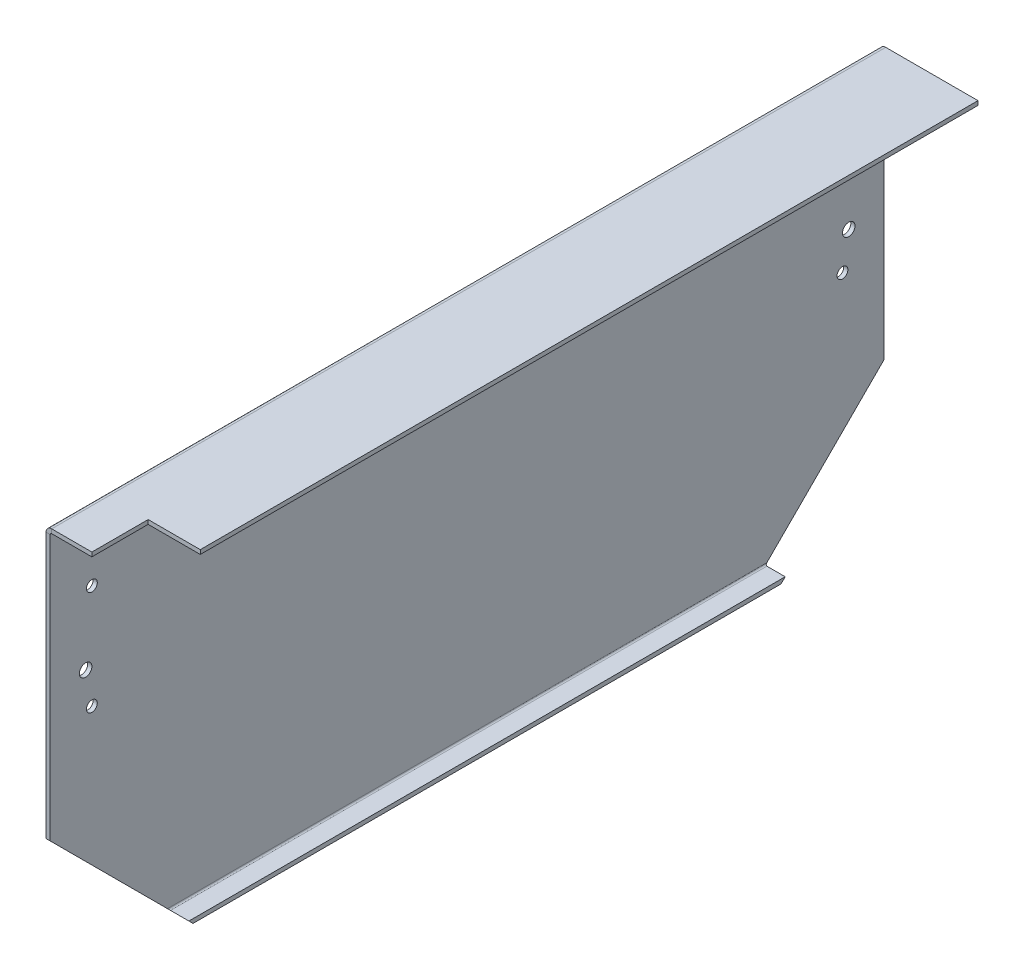
ISO-10303-21;
HEADER;
FILE_DESCRIPTION(('STEP AP214'),'2;1');
FILE_NAME('part.step','',(''),(''),'','','');
FILE_SCHEMA(('AUTOMOTIVE_DESIGN { 1 0 10303 214 1 1 1 1 }'));
ENDSEC;
DATA;
#1=APPLICATION_CONTEXT('core data for automotive mechanical design processes');
#2=APPLICATION_PROTOCOL_DEFINITION('international standard','automotive_design',2000,#1);
#3=PRODUCT_CONTEXT('',#1,'mechanical');
#4=PRODUCT('Part','Part','',(#3));
#5=PRODUCT_RELATED_PRODUCT_CATEGORY('part','',(#4));
#6=PRODUCT_DEFINITION_FORMATION('','',#4);
#7=PRODUCT_DEFINITION_CONTEXT('part definition',#1,'design');
#8=PRODUCT_DEFINITION('design','',#6,#7);
#9=PRODUCT_DEFINITION_SHAPE('','',#8);
#10=(LENGTH_UNIT() NAMED_UNIT(*) SI_UNIT(.MILLI.,.METRE.));
#11=(NAMED_UNIT(*) PLANE_ANGLE_UNIT() SI_UNIT($,.RADIAN.));
#12=(NAMED_UNIT(*) SI_UNIT($,.STERADIAN.) SOLID_ANGLE_UNIT());
#13=UNCERTAINTY_MEASURE_WITH_UNIT(LENGTH_MEASURE(1.E-05),#10,'distance_accuracy_value','');
#14=(GEOMETRIC_REPRESENTATION_CONTEXT(3) GLOBAL_UNCERTAINTY_ASSIGNED_CONTEXT((#13)) GLOBAL_UNIT_ASSIGNED_CONTEXT((#10,
#11,#12)) REPRESENTATION_CONTEXT('',''));
#15=CARTESIAN_POINT('',(0.,0.,0.));
#16=DIRECTION('',(0.,0.,1.));
#17=DIRECTION('',(1.,0.,0.));
#18=AXIS2_PLACEMENT_3D('',#15,#16,#17);
#19=CARTESIAN_POINT('',(89.,-146.,400.));
#20=DIRECTION('',(1.,0.,0.));
#21=DIRECTION('',(0.,1.,0.));
#22=AXIS2_PLACEMENT_3D('',#19,#20,#21);
#23=PLANE('',#22);
#24=CARTESIAN_POINT('',(89.,-211.5,17.));
#25=DIRECTION('',(-1.,0.,0.));
#26=DIRECTION('',(0.,0.,1.));
#27=AXIS2_PLACEMENT_3D('',#24,#25,#26);
#28=CIRCLE('',#27,2.99999999999998);
#29=CARTESIAN_POINT('',(89.,-211.5,20.));
#30=VERTEX_POINT('',#29);
#31=EDGE_CURVE('E176',#30,#30,#28,.T.);
#32=ORIENTED_EDGE('',*,*,#31,.F.);
#33=EDGE_LOOP('',(#32));
#34=FACE_BOUND('',#33,.T.);
#35=CARTESIAN_POINT('',(89.,-211.5,383.));
#36=DIRECTION('',(-1.,0.,0.));
#37=DIRECTION('',(0.,0.,1.));
#38=AXIS2_PLACEMENT_3D('',#35,#36,#37);
#39=CIRCLE('',#38,2.99999999999998);
#40=CARTESIAN_POINT('',(89.,-211.5,386.));
#41=VERTEX_POINT('',#40);
#42=EDGE_CURVE('E180',#41,#41,#39,.T.);
#43=ORIENTED_EDGE('',*,*,#42,.F.);
#44=EDGE_LOOP('',(#43));
#45=FACE_BOUND('',#44,.T.);
#46=CARTESIAN_POINT('',(89.,-178.,20.0000000000001));
#47=DIRECTION('',(-1.,0.,0.));
#48=DIRECTION('',(0.,0.,1.));
#49=AXIS2_PLACEMENT_3D('',#46,#47,#48);
#50=CIRCLE('',#49,2.59999999999999);
#51=CARTESIAN_POINT('',(89.,-178.,22.6000000000001));
#52=VERTEX_POINT('',#51);
#53=EDGE_CURVE('E220',#52,#52,#50,.T.);
#54=ORIENTED_EDGE('',*,*,#53,.F.);
#55=EDGE_LOOP('',(#54));
#56=FACE_BOUND('',#55,.T.);
#57=CARTESIAN_POINT('',(89.,-228.,20.0000000000001));
#58=DIRECTION('',(-1.,0.,0.));
#59=DIRECTION('',(0.,0.,1.));
#60=AXIS2_PLACEMENT_3D('',#57,#58,#59);
#61=CIRCLE('',#60,2.59999999999999);
#62=CARTESIAN_POINT('',(89.,-228.,22.6000000000001));
#63=VERTEX_POINT('',#62);
#64=EDGE_CURVE('E226',#63,#63,#61,.T.);
#65=ORIENTED_EDGE('',*,*,#64,.F.);
#66=EDGE_LOOP('',(#65));
#67=FACE_BOUND('',#66,.T.);
#68=CARTESIAN_POINT('',(89.,-178.,380.));
#69=DIRECTION('',(-1.,0.,0.));
#70=DIRECTION('',(0.,0.,1.));
#71=AXIS2_PLACEMENT_3D('',#68,#69,#70);
#72=CIRCLE('',#71,2.59999999999999);
#73=CARTESIAN_POINT('',(89.,-178.,382.6));
#74=VERTEX_POINT('',#73);
#75=EDGE_CURVE('E232',#74,#74,#72,.T.);
#76=ORIENTED_EDGE('',*,*,#75,.F.);
#77=EDGE_LOOP('',(#76));
#78=FACE_BOUND('',#77,.T.);
#79=CARTESIAN_POINT('',(89.,-228.,380.));
#80=DIRECTION('',(-1.,0.,0.));
#81=DIRECTION('',(0.,0.,1.));
#82=AXIS2_PLACEMENT_3D('',#79,#80,#81);
#83=CIRCLE('',#82,2.59999999999999);
#84=CARTESIAN_POINT('',(89.,-228.,382.6));
#85=VERTEX_POINT('',#84);
#86=EDGE_CURVE('E238',#85,#85,#83,.T.);
#87=ORIENTED_EDGE('',*,*,#86,.F.);
#88=EDGE_LOOP('',(#87));
#89=FACE_BOUND('',#88,.T.);
#90=DIRECTION('',(0.,-1.,0.));
#91=VECTOR('',#90,1.);
#92=CARTESIAN_POINT('',(89.,-146.,0.));
#93=LINE('',#92,#91);
#94=CARTESIAN_POINT('',(89.,-146.7366,0.));
#95=VERTEX_POINT('',#94);
#96=CARTESIAN_POINT('',(89.,-274.,0.));
#97=VERTEX_POINT('',#96);
#98=EDGE_CURVE('E249',#95,#97,#93,.T.);
#99=ORIENTED_EDGE('',*,*,#98,.T.);
#100=DIRECTION('',(0.,-0.707106781186551,0.707106781186544));
#101=VECTOR('',#100,1.);
#102=CARTESIAN_POINT('',(89.0000000000001,-409.999999999999,135.999999999998));
#103=LINE('',#102,#101);
#104=CARTESIAN_POINT('',(89.0000000000001,-330.2634,56.2633999999995));
#105=VERTEX_POINT('',#104);
#106=EDGE_CURVE('E189',#97,#105,#103,.T.);
#107=ORIENTED_EDGE('',*,*,#106,.T.);
#108=DIRECTION('',(0.,0.,-1.));
#109=VECTOR('',#108,1.);
#110=CARTESIAN_POINT('',(89.0000000000001,-330.2634,400.));
#111=LINE('',#110,#109);
#112=CARTESIAN_POINT('',(89.0000000000001,-330.2634,343.736600000001));
#113=VERTEX_POINT('',#112);
#114=EDGE_CURVE('E281',#113,#105,#111,.T.);
#115=ORIENTED_EDGE('',*,*,#114,.F.);
#116=DIRECTION('',(0.,-0.707106781186551,-0.707106781186544));
#117=VECTOR('',#116,1.);
#118=CARTESIAN_POINT('',(89.,-209.999999999999,464.));
#119=LINE('',#118,#117);
#120=CARTESIAN_POINT('',(89.,-274.,400.));
#121=VERTEX_POINT('',#120);
#122=EDGE_CURVE('E209',#121,#113,#119,.T.);
#123=ORIENTED_EDGE('',*,*,#122,.F.);
#124=DIRECTION('',(0.,-1.,0.));
#125=VECTOR('',#124,1.);
#126=CARTESIAN_POINT('',(89.,-146.,400.));
#127=LINE('',#126,#125);
#128=CARTESIAN_POINT('',(89.,-146.7366,400.));
#129=VERTEX_POINT('',#128);
#130=EDGE_CURVE('E258',#129,#121,#127,.T.);
#131=ORIENTED_EDGE('',*,*,#130,.F.);
#132=DIRECTION('',(0.,0.,-1.));
#133=VECTOR('',#132,1.);
#134=CARTESIAN_POINT('',(89.,-146.7366,400.));
#135=LINE('',#134,#133);
#136=EDGE_CURVE('E284',#129,#95,#135,.T.);
#137=ORIENTED_EDGE('',*,*,#136,.T.);
#138=EDGE_LOOP('',(#99,#107,#115,#123,#131,#137));
#139=FACE_BOUND('',#138,.T.);
#140=ADVANCED_FACE('F38',(#34,#45,#56,#67,#78,#89,#139),#23,.F.);
#141=CARTESIAN_POINT('',(91.7366,-144.,400.));
#142=DIRECTION('',(0.,0.,1.));
#143=DIRECTION('',(1.,0.,0.));
#144=AXIS2_PLACEMENT_3D('',#141,#142,#143);
#145=PLANE('',#144);
#146=ORIENTED_EDGE('',*,*,#130,.T.);
#147=DIRECTION('',(-1.,0.,0.));
#148=VECTOR('',#147,1.);
#149=CARTESIAN_POINT('',(645.116557027392,-274.,400.));
#150=LINE('',#149,#148);
#151=CARTESIAN_POINT('',(91.,-274.,400.));
#152=VERTEX_POINT('',#151);
#153=EDGE_CURVE('E203',#152,#121,#150,.T.);
#154=ORIENTED_EDGE('',*,*,#153,.F.);
#155=DIRECTION('',(0.,-1.,0.));
#156=VECTOR('',#155,1.);
#157=CARTESIAN_POINT('',(91.,-146.,400.));
#158=LINE('',#157,#156);
#159=CARTESIAN_POINT('',(91.,-146.7366,400.));
#160=VERTEX_POINT('',#159);
#161=EDGE_CURVE('E245',#160,#152,#158,.T.);
#162=ORIENTED_EDGE('',*,*,#161,.F.);
#163=DIRECTION('',(-1.,0.,0.));
#164=VECTOR('',#163,1.);
#165=CARTESIAN_POINT('',(91.,-146.7366,400.));
#166=LINE('',#165,#164);
#167=EDGE_CURVE('E318',#160,#129,#166,.T.);
#168=ORIENTED_EDGE('',*,*,#167,.T.);
#169=EDGE_LOOP('',(#146,#154,#162,#168));
#170=FACE_BOUND('',#169,.T.);
#171=ADVANCED_FACE('F359',(#170),#145,.T.);
#172=CARTESIAN_POINT('',(91.0000000000001,-333.,400.));
#173=DIRECTION('',(0.,1.,0.));
#174=DIRECTION('',(0.,0.,1.));
#175=AXIS2_PLACEMENT_3D('',#172,#173,#174);
#176=PLANE('',#175);
#177=DIRECTION('',(0.,0.,-1.));
#178=VECTOR('',#177,1.);
#179=CARTESIAN_POINT('',(91.7366000000001,-333.,400.));
#180=LINE('',#179,#178);
#181=CARTESIAN_POINT('',(91.7366000000001,-333.,341.000000000001));
#182=VERTEX_POINT('',#181);
#183=CARTESIAN_POINT('',(91.7366000000001,-333.,58.9999999999994));
#184=VERTEX_POINT('',#183);
#185=EDGE_CURVE('E261',#182,#184,#180,.T.);
#186=ORIENTED_EDGE('',*,*,#185,.T.);
#187=DIRECTION('',(1.,0.,0.));
#188=VECTOR('',#187,1.);
#189=CARTESIAN_POINT('',(91.0000000000002,-333.,58.9999999999994));
#190=LINE('',#189,#188);
#191=CARTESIAN_POINT('',(100.527645565856,-333.,58.9999999999995));
#192=VERTEX_POINT('',#191);
#193=EDGE_CURVE('E60',#184,#192,#190,.T.);
#194=ORIENTED_EDGE('',*,*,#193,.T.);
#195=DIRECTION('',(0.,0.,-1.));
#196=VECTOR('',#195,1.);
#197=CARTESIAN_POINT('',(100.527645565856,-333.,400.));
#198=LINE('',#197,#196);
#199=CARTESIAN_POINT('',(100.527645565856,-333.,341.000000000001));
#200=VERTEX_POINT('',#199);
#201=EDGE_CURVE('E309',#200,#192,#198,.T.);
#202=ORIENTED_EDGE('',*,*,#201,.F.);
#203=DIRECTION('',(1.,0.,0.));
#204=VECTOR('',#203,1.);
#205=CARTESIAN_POINT('',(91.,-333.,341.000000000001));
#206=LINE('',#205,#204);
#207=EDGE_CURVE('E206',#182,#200,#206,.T.);
#208=ORIENTED_EDGE('',*,*,#207,.F.);
#209=EDGE_LOOP('',(#186,#194,#202,#208));
#210=FACE_BOUND('',#209,.T.);
#211=ADVANCED_FACE('F379',(#210),#176,.F.);
#212=CARTESIAN_POINT('',(100.527645565856,-331.,400.));
#213=DIRECTION('',(1.,0.,0.));
#214=DIRECTION('',(0.,0.,-1.));
#215=AXIS2_PLACEMENT_3D('',#212,#213,#214);
#216=PLANE('',#215);
#217=DIRECTION('',(0.,-0.707106781186551,0.707106781186544));
#218=VECTOR('',#217,1.);
#219=CARTESIAN_POINT('',(100.527645565856,-502.5,228.499999999998));
#220=LINE('',#219,#218);
#221=CARTESIAN_POINT('',(100.527645565856,-331.,56.9999999999994));
#222=VERTEX_POINT('',#221);
#223=EDGE_CURVE('E191',#222,#192,#220,.T.);
#224=ORIENTED_EDGE('',*,*,#223,.F.);
#225=DIRECTION('',(0.,0.,-1.));
#226=VECTOR('',#225,1.);
#227=CARTESIAN_POINT('',(100.527645565856,-331.,400.));
#228=LINE('',#227,#226);
#229=CARTESIAN_POINT('',(100.527645565856,-331.,343.000000000001));
#230=VERTEX_POINT('',#229);
#231=EDGE_CURVE('E306',#230,#222,#228,.T.);
#232=ORIENTED_EDGE('',*,*,#231,.F.);
#233=DIRECTION('',(0.,-0.707106781186551,-0.707106781186544));
#234=VECTOR('',#233,1.);
#235=CARTESIAN_POINT('',(100.527645565856,-302.5,371.5));
#236=LINE('',#235,#234);
#237=EDGE_CURVE('E212',#230,#200,#236,.T.);
#238=ORIENTED_EDGE('',*,*,#237,.T.);
#239=ORIENTED_EDGE('',*,*,#201,.T.);
#240=EDGE_LOOP('',(#224,#232,#238,#239));
#241=FACE_BOUND('',#240,.T.);
#242=ADVANCED_FACE('F395',(#241),#216,.T.);
#243=CARTESIAN_POINT('',(91.0000000000001,-331.,400.));
#244=DIRECTION('',(0.,1.,0.));
#245=DIRECTION('',(0.,0.,1.));
#246=AXIS2_PLACEMENT_3D('',#243,#244,#245);
#247=PLANE('',#246);
#248=DIRECTION('',(1.,0.,0.));
#249=VECTOR('',#248,1.);
#250=CARTESIAN_POINT('',(91.0000000000002,-331.,56.9999999999994));
#251=LINE('',#250,#249);
#252=CARTESIAN_POINT('',(91.7366000000001,-331.,56.9999999999994));
#253=VERTEX_POINT('',#252);
#254=EDGE_CURVE('E194',#253,#222,#251,.T.);
#255=ORIENTED_EDGE('',*,*,#254,.F.);
#256=DIRECTION('',(0.,0.,-1.));
#257=VECTOR('',#256,1.);
#258=CARTESIAN_POINT('',(91.7366000000001,-331.,400.));
#259=LINE('',#258,#257);
#260=CARTESIAN_POINT('',(91.7366000000001,-331.,343.000000000001));
#261=VERTEX_POINT('',#260);
#262=EDGE_CURVE('E303',#261,#253,#259,.T.);
#263=ORIENTED_EDGE('',*,*,#262,.F.);
#264=DIRECTION('',(1.,0.,0.));
#265=VECTOR('',#264,1.);
#266=CARTESIAN_POINT('',(91.,-331.,343.000000000001));
#267=LINE('',#266,#265);
#268=EDGE_CURVE('E214',#261,#230,#267,.T.);
#269=ORIENTED_EDGE('',*,*,#268,.T.);
#270=ORIENTED_EDGE('',*,*,#231,.T.);
#271=EDGE_LOOP('',(#255,#263,#269,#270));
#272=FACE_BOUND('',#271,.T.);
#273=ADVANCED_FACE('F392',(#272),#247,.T.);
#274=CARTESIAN_POINT('',(91.7366000000001,-330.2634,400.));
#275=DIRECTION('',(0.,0.,-1.));
#276=DIRECTION('',(-1.,0.,0.));
#277=AXIS2_PLACEMENT_3D('',#274,#275,#276);
#278=CYLINDRICAL_SURFACE('',#277,0.7366);
#279=CARTESIAN_POINT('',(91.7366000000001,-330.2634,56.2633999999995));
#280=DIRECTION('',(0.,0.707106781186544,0.707106781186551));
#281=DIRECTION('',(0.,0.707106781186551,-0.707106781186544));
#282=AXIS2_PLACEMENT_3D('',#279,#280,#281);
#283=ELLIPSE('',#282,1.04170971004402,0.7366);
#284=CARTESIAN_POINT('',(91.0000000000001,-330.2634,56.2633999999995));
#285=VERTEX_POINT('',#284);
#286=EDGE_CURVE('E197',#285,#253,#283,.T.);
#287=ORIENTED_EDGE('',*,*,#286,.F.);
#288=DIRECTION('',(0.,0.,-1.));
#289=VECTOR('',#288,1.);
#290=CARTESIAN_POINT('',(91.0000000000001,-330.2634,400.));
#291=LINE('',#290,#289);
#292=CARTESIAN_POINT('',(91.0000000000001,-330.2634,343.736600000001));
#293=VERTEX_POINT('',#292);
#294=EDGE_CURVE('E300',#293,#285,#291,.T.);
#295=ORIENTED_EDGE('',*,*,#294,.F.);
#296=CARTESIAN_POINT('',(91.7366000000001,-330.2634,343.736600000001));
#297=DIRECTION('',(0.,-0.707106781186544,0.707106781186551));
#298=DIRECTION('',(0.,-0.707106781186551,-0.707106781186544));
#299=AXIS2_PLACEMENT_3D('',#296,#297,#298);
#300=ELLIPSE('',#299,1.04170971004402,0.7366);
#301=EDGE_CURVE('E216',#293,#261,#300,.T.);
#302=ORIENTED_EDGE('',*,*,#301,.T.);
#303=ORIENTED_EDGE('',*,*,#262,.T.);
#304=EDGE_LOOP('',(#287,#295,#302,#303));
#305=FACE_BOUND('',#304,.T.);
#306=ADVANCED_FACE('F334',(#305),#278,.F.);
#307=CARTESIAN_POINT('',(91.,-146.,400.));
#308=DIRECTION('',(1.,0.,0.));
#309=DIRECTION('',(0.,1.,0.));
#310=AXIS2_PLACEMENT_3D('',#307,#308,#309);
#311=PLANE('',#310);
#312=CARTESIAN_POINT('',(91.,-211.5,17.));
#313=DIRECTION('',(1.,0.,0.));
#314=DIRECTION('',(0.,1.,0.));
#315=AXIS2_PLACEMENT_3D('',#312,#313,#314);
#316=CIRCLE('',#315,2.99999999999996);
#317=CARTESIAN_POINT('',(91.,-208.5,17.));
#318=VERTEX_POINT('',#317);
#319=EDGE_CURVE('E179',#318,#318,#316,.T.);
#320=ORIENTED_EDGE('',*,*,#319,.F.);
#321=EDGE_LOOP('',(#320));
#322=FACE_BOUND('',#321,.T.);
#323=CARTESIAN_POINT('',(91.,-211.5,383.));
#324=DIRECTION('',(1.,0.,0.));
#325=DIRECTION('',(0.,1.,0.));
#326=AXIS2_PLACEMENT_3D('',#323,#324,#325);
#327=CIRCLE('',#326,2.99999999999996);
#328=CARTESIAN_POINT('',(91.,-208.5,383.));
#329=VERTEX_POINT('',#328);
#330=EDGE_CURVE('E183',#329,#329,#327,.T.);
#331=ORIENTED_EDGE('',*,*,#330,.F.);
#332=EDGE_LOOP('',(#331));
#333=FACE_BOUND('',#332,.T.);
#334=DIRECTION('',(0.,-0.707106781186551,0.707106781186544));
#335=VECTOR('',#334,1.);
#336=CARTESIAN_POINT('',(91.0000000000001,-409.999999999999,135.999999999998));
#337=LINE('',#336,#335);
#338=CARTESIAN_POINT('',(91.0000000000001,-274.,0.));
#339=VERTEX_POINT('',#338);
#340=EDGE_CURVE('E200',#339,#285,#337,.T.);
#341=ORIENTED_EDGE('',*,*,#340,.F.);
#342=DIRECTION('',(0.,-1.,0.));
#343=VECTOR('',#342,1.);
#344=CARTESIAN_POINT('',(91.,-146.,0.));
#345=LINE('',#344,#343);
#346=CARTESIAN_POINT('',(91.,-146.7366,0.));
#347=VERTEX_POINT('',#346);
#348=EDGE_CURVE('E244',#347,#339,#345,.T.);
#349=ORIENTED_EDGE('',*,*,#348,.F.);
#350=DIRECTION('',(0.,0.,-1.));
#351=VECTOR('',#350,1.);
#352=CARTESIAN_POINT('',(91.,-146.7366,400.));
#353=LINE('',#352,#351);
#354=EDGE_CURVE('E297',#160,#347,#353,.T.);
#355=ORIENTED_EDGE('',*,*,#354,.F.);
#356=ORIENTED_EDGE('',*,*,#161,.T.);
#357=DIRECTION('',(0.,-0.707106781186551,-0.707106781186544));
#358=VECTOR('',#357,1.);
#359=CARTESIAN_POINT('',(91.,-209.999999999999,464.));
#360=LINE('',#359,#358);
#361=EDGE_CURVE('E218',#152,#293,#360,.T.);
#362=ORIENTED_EDGE('',*,*,#361,.T.);
#363=ORIENTED_EDGE('',*,*,#294,.T.);
#364=EDGE_LOOP('',(#341,#349,#355,#356,#362,#363));
#365=FACE_BOUND('',#364,.T.);
#366=CARTESIAN_POINT('',(91.,-228.,380.));
#367=DIRECTION('',(1.,0.,0.));
#368=DIRECTION('',(0.,1.,0.));
#369=AXIS2_PLACEMENT_3D('',#366,#367,#368);
#370=CIRCLE('',#369,2.59999999999999);
#371=CARTESIAN_POINT('',(91.,-225.4,380.));
#372=VERTEX_POINT('',#371);
#373=EDGE_CURVE('E241',#372,#372,#370,.T.);
#374=ORIENTED_EDGE('',*,*,#373,.F.);
#375=EDGE_LOOP('',(#374));
#376=FACE_BOUND('',#375,.T.);
#377=CARTESIAN_POINT('',(91.,-178.,380.));
#378=DIRECTION('',(1.,0.,0.));
#379=DIRECTION('',(0.,1.,0.));
#380=AXIS2_PLACEMENT_3D('',#377,#378,#379);
#381=CIRCLE('',#380,2.59999999999999);
#382=CARTESIAN_POINT('',(91.,-175.4,380.));
#383=VERTEX_POINT('',#382);
#384=EDGE_CURVE('E235',#383,#383,#381,.T.);
#385=ORIENTED_EDGE('',*,*,#384,.F.);
#386=EDGE_LOOP('',(#385));
#387=FACE_BOUND('',#386,.T.);
#388=CARTESIAN_POINT('',(91.,-228.,20.0000000000001));
#389=DIRECTION('',(1.,0.,0.));
#390=DIRECTION('',(0.,1.,0.));
#391=AXIS2_PLACEMENT_3D('',#388,#389,#390);
#392=CIRCLE('',#391,2.59999999999999);
#393=CARTESIAN_POINT('',(91.,-225.4,20.0000000000001));
#394=VERTEX_POINT('',#393);
#395=EDGE_CURVE('E229',#394,#394,#392,.T.);
#396=ORIENTED_EDGE('',*,*,#395,.F.);
#397=EDGE_LOOP('',(#396));
#398=FACE_BOUND('',#397,.T.);
#399=CARTESIAN_POINT('',(91.,-178.,20.0000000000001));
#400=DIRECTION('',(1.,0.,0.));
#401=DIRECTION('',(0.,1.,0.));
#402=AXIS2_PLACEMENT_3D('',#399,#400,#401);
#403=CIRCLE('',#402,2.59999999999999);
#404=CARTESIAN_POINT('',(91.,-175.4,20.0000000000001));
#405=VERTEX_POINT('',#404);
#406=EDGE_CURVE('E223',#405,#405,#403,.T.);
#407=ORIENTED_EDGE('',*,*,#406,.F.);
#408=EDGE_LOOP('',(#407));
#409=FACE_BOUND('',#408,.T.);
#410=ADVANCED_FACE('F330',(#322,#333,#365,#376,#387,#398,#409),#311,.T.);
#411=CARTESIAN_POINT('',(91.7366000000001,-330.2634,400.));
#412=DIRECTION('',(0.,0.,-1.));
#413=DIRECTION('',(-1.,0.,0.));
#414=AXIS2_PLACEMENT_3D('',#411,#412,#413);
#415=CYLINDRICAL_SURFACE('',#414,2.7366);
#416=ORIENTED_EDGE('',*,*,#114,.T.);
#417=CARTESIAN_POINT('',(91.7366000000001,-330.2634,56.2633999999995));
#418=DIRECTION('',(0.,0.707106781186544,0.707106781186551));
#419=DIRECTION('',(0.,0.707106781186551,-0.707106781186544));
#420=AXIS2_PLACEMENT_3D('',#417,#418,#419);
#421=ELLIPSE('',#420,3.87013683479019,2.7366);
#422=EDGE_CURVE('E186',#105,#184,#421,.T.);
#423=ORIENTED_EDGE('',*,*,#422,.T.);
#424=ORIENTED_EDGE('',*,*,#185,.F.);
#425=CARTESIAN_POINT('',(91.7366000000001,-330.2634,343.736600000001));
#426=DIRECTION('',(0.,-0.707106781186544,0.707106781186551));
#427=DIRECTION('',(0.,-0.707106781186551,-0.707106781186544));
#428=AXIS2_PLACEMENT_3D('',#425,#426,#427);
#429=ELLIPSE('',#428,3.87013683479019,2.7366);
#430=EDGE_CURVE('E320',#113,#182,#429,.T.);
#431=ORIENTED_EDGE('',*,*,#430,.F.);
#432=EDGE_LOOP('',(#416,#423,#424,#431));
#433=FACE_BOUND('',#432,.T.);
#434=ADVANCED_FACE('F333',(#433),#415,.T.);
#435=CARTESIAN_POINT('',(91.,-146.7366,400.));
#436=DIRECTION('',(0.,0.,1.));
#437=DIRECTION('',(1.,0.,0.));
#438=AXIS2_PLACEMENT_3D('',#435,#436,#437);
#439=PLANE('',#438);
#440=ORIENTED_EDGE('',*,*,#167,.F.);
#441=CARTESIAN_POINT('',(91.7366,-146.7366,400.));
#442=DIRECTION('',(0.,0.,-1.));
#443=DIRECTION('',(-1.,0.,0.));
#444=AXIS2_PLACEMENT_3D('',#441,#442,#443);
#445=CIRCLE('',#444,0.7366);
#446=CARTESIAN_POINT('',(91.7366,-146.,400.));
#447=VERTEX_POINT('',#446);
#448=EDGE_CURVE('E248',#447,#160,#445,.F.);
#449=ORIENTED_EDGE('',*,*,#448,.F.);
#450=DIRECTION('',(0.,-1.,0.));
#451=VECTOR('',#450,1.);
#452=CARTESIAN_POINT('',(91.7366,-144.,400.));
#453=LINE('',#452,#451);
#454=CARTESIAN_POINT('',(91.7366,-144.,400.));
#455=VERTEX_POINT('',#454);
#456=EDGE_CURVE('E315',#455,#447,#453,.T.);
#457=ORIENTED_EDGE('',*,*,#456,.F.);
#458=CARTESIAN_POINT('',(91.7366,-146.7366,400.));
#459=DIRECTION('',(0.,0.,1.));
#460=DIRECTION('',(1.,0.,0.));
#461=AXIS2_PLACEMENT_3D('',#458,#459,#460);
#462=CIRCLE('',#461,2.7366);
#463=EDGE_CURVE('E255',#455,#129,#462,.T.);
#464=ORIENTED_EDGE('',*,*,#463,.T.);
#465=EDGE_LOOP('',(#440,#449,#457,#464));
#466=FACE_BOUND('',#465,.T.);
#467=ADVANCED_FACE('F40',(#466),#439,.T.);
#468=CARTESIAN_POINT('',(91.7366,-146.,0.));
#469=DIRECTION('',(0.,0.,-1.));
#470=DIRECTION('',(-1.,0.,0.));
#471=AXIS2_PLACEMENT_3D('',#468,#469,#470);
#472=PLANE('',#471);
#473=DIRECTION('',(0.,1.,0.));
#474=VECTOR('',#473,1.);
#475=CARTESIAN_POINT('',(91.7366,-146.,0.));
#476=LINE('',#475,#474);
#477=CARTESIAN_POINT('',(91.7366,-146.,0.));
#478=VERTEX_POINT('',#477);
#479=CARTESIAN_POINT('',(91.7366,-144.,0.));
#480=VERTEX_POINT('',#479);
#481=EDGE_CURVE('E313',#478,#480,#476,.T.);
#482=ORIENTED_EDGE('',*,*,#481,.F.);
#483=CARTESIAN_POINT('',(91.7366,-146.7366,0.));
#484=DIRECTION('',(0.,0.,-1.));
#485=DIRECTION('',(-1.,0.,0.));
#486=AXIS2_PLACEMENT_3D('',#483,#484,#485);
#487=CIRCLE('',#486,0.7366);
#488=EDGE_CURVE('E263',#478,#347,#487,.F.);
#489=ORIENTED_EDGE('',*,*,#488,.T.);
#490=DIRECTION('',(1.,0.,0.));
#491=VECTOR('',#490,1.);
#492=CARTESIAN_POINT('',(89.,-146.7366,0.));
#493=LINE('',#492,#491);
#494=EDGE_CURVE('E311',#95,#347,#493,.T.);
#495=ORIENTED_EDGE('',*,*,#494,.F.);
#496=CARTESIAN_POINT('',(91.7366,-146.7366,0.));
#497=DIRECTION('',(0.,0.,1.));
#498=DIRECTION('',(1.,0.,0.));
#499=AXIS2_PLACEMENT_3D('',#496,#497,#498);
#500=CIRCLE('',#499,2.7366);
#501=EDGE_CURVE('E275',#480,#95,#500,.T.);
#502=ORIENTED_EDGE('',*,*,#501,.F.);
#503=EDGE_LOOP('',(#482,#489,#495,#502));
#504=FACE_BOUND('',#503,.T.);
#505=ADVANCED_FACE('F413',(#504),#472,.T.);
#506=CARTESIAN_POINT('',(89.,-146.7366,0.));
#507=DIRECTION('',(0.,0.,-1.));
#508=DIRECTION('',(-1.,0.,0.));
#509=AXIS2_PLACEMENT_3D('',#506,#507,#508);
#510=PLANE('',#509);
#511=DIRECTION('',(-1.,0.,0.));
#512=VECTOR('',#511,1.);
#513=CARTESIAN_POINT('',(136.,-146.,0.));
#514=LINE('',#513,#512);
#515=CARTESIAN_POINT('',(136.,-146.,0.));
#516=VERTEX_POINT('',#515);
#517=EDGE_CURVE('E266',#516,#478,#514,.T.);
#518=ORIENTED_EDGE('',*,*,#517,.T.);
#519=ORIENTED_EDGE('',*,*,#481,.T.);
#520=DIRECTION('',(1.,0.,0.));
#521=VECTOR('',#520,1.);
#522=CARTESIAN_POINT('',(136.,-144.,0.));
#523=LINE('',#522,#521);
#524=CARTESIAN_POINT('',(136.,-144.,0.));
#525=VERTEX_POINT('',#524);
#526=EDGE_CURVE('E272',#525,#480,#523,.F.);
#527=ORIENTED_EDGE('',*,*,#526,.F.);
#528=DIRECTION('',(0.,-1.,0.));
#529=VECTOR('',#528,1.);
#530=CARTESIAN_POINT('',(136.,-144.,0.));
#531=LINE('',#530,#529);
#532=EDGE_CURVE('E269',#525,#516,#531,.T.);
#533=ORIENTED_EDGE('',*,*,#532,.T.);
#534=EDGE_LOOP('',(#518,#519,#527,#533));
#535=FACE_BOUND('',#534,.T.);
#536=ADVANCED_FACE('F410',(#535),#510,.T.);
#537=CARTESIAN_POINT('',(91.7366000000001,-333.,0.));
#538=DIRECTION('',(0.,0.,-1.));
#539=DIRECTION('',(-1.,0.,0.));
#540=AXIS2_PLACEMENT_3D('',#537,#538,#539);
#541=PLANE('',#540);
#542=DIRECTION('',(1.,0.,0.));
#543=VECTOR('',#542,1.);
#544=CARTESIAN_POINT('',(91.7366,-274.,0.));
#545=LINE('',#544,#543);
#546=EDGE_CURVE('E46',#97,#339,#545,.T.);
#547=ORIENTED_EDGE('',*,*,#546,.F.);
#548=ORIENTED_EDGE('',*,*,#98,.F.);
#549=ORIENTED_EDGE('',*,*,#494,.T.);
#550=ORIENTED_EDGE('',*,*,#348,.T.);
#551=EDGE_LOOP('',(#547,#548,#549,#550));
#552=FACE_BOUND('',#551,.T.);
#553=ADVANCED_FACE('F406',(#552),#541,.T.);
#554=CARTESIAN_POINT('',(91.7366,-146.7366,400.));
#555=DIRECTION('',(0.,0.,-1.));
#556=DIRECTION('',(-1.,0.,0.));
#557=AXIS2_PLACEMENT_3D('',#554,#555,#556);
#558=CYLINDRICAL_SURFACE('',#557,0.7366);
#559=ORIENTED_EDGE('',*,*,#488,.F.);
#560=DIRECTION('',(0.,0.,-1.));
#561=VECTOR('',#560,1.);
#562=CARTESIAN_POINT('',(91.7366,-146.,400.));
#563=LINE('',#562,#561);
#564=EDGE_CURVE('E294',#447,#478,#563,.T.);
#565=ORIENTED_EDGE('',*,*,#564,.F.);
#566=ORIENTED_EDGE('',*,*,#448,.T.);
#567=ORIENTED_EDGE('',*,*,#354,.T.);
#568=EDGE_LOOP('',(#559,#565,#566,#567));
#569=FACE_BOUND('',#568,.T.);
#570=ADVANCED_FACE('F409',(#569),#558,.F.);
#571=CARTESIAN_POINT('',(136.,-146.,400.));
#572=DIRECTION('',(0.,-1.,0.));
#573=DIRECTION('',(0.,0.,-1.));
#574=AXIS2_PLACEMENT_3D('',#571,#572,#573);
#575=PLANE('',#574);
#576=DIRECTION('',(0.,0.,-1.));
#577=VECTOR('',#576,1.);
#578=CARTESIAN_POINT('',(111.,-146.,400.));
#579=LINE('',#578,#577);
#580=CARTESIAN_POINT('',(111.,-146.,400.));
#581=VERTEX_POINT('',#580);
#582=CARTESIAN_POINT('',(111.,-146.,373.));
#583=VERTEX_POINT('',#582);
#584=EDGE_CURVE('E154',#581,#583,#579,.T.);
#585=ORIENTED_EDGE('',*,*,#584,.F.);
#586=DIRECTION('',(-1.,0.,0.));
#587=VECTOR('',#586,1.);
#588=CARTESIAN_POINT('',(136.,-146.,400.));
#589=LINE('',#588,#587);
#590=EDGE_CURVE('E252',#581,#447,#589,.T.);
#591=ORIENTED_EDGE('',*,*,#590,.T.);
#592=ORIENTED_EDGE('',*,*,#564,.T.);
#593=ORIENTED_EDGE('',*,*,#517,.F.);
#594=DIRECTION('',(0.,0.,-1.));
#595=VECTOR('',#594,1.);
#596=CARTESIAN_POINT('',(136.,-146.,400.));
#597=LINE('',#596,#595);
#598=CARTESIAN_POINT('',(136.,-146.,373.));
#599=VERTEX_POINT('',#598);
#600=EDGE_CURVE('E292',#599,#516,#597,.T.);
#601=ORIENTED_EDGE('',*,*,#600,.F.);
#602=DIRECTION('',(1.,0.,0.));
#603=VECTOR('',#602,1.);
#604=CARTESIAN_POINT('',(136.,-146.,373.));
#605=LINE('',#604,#603);
#606=EDGE_CURVE('E174',#583,#599,#605,.T.);
#607=ORIENTED_EDGE('',*,*,#606,.F.);
#608=EDGE_LOOP('',(#585,#591,#592,#593,#601,#607));
#609=FACE_BOUND('',#608,.T.);
#610=ADVANCED_FACE('F513',(#609),#575,.T.);
#611=CARTESIAN_POINT('',(136.,-144.,400.));
#612=DIRECTION('',(1.,0.,0.));
#613=DIRECTION('',(0.,0.,-1.));
#614=AXIS2_PLACEMENT_3D('',#611,#612,#613);
#615=PLANE('',#614);
#616=DIRECTION('',(0.,1.,0.));
#617=VECTOR('',#616,1.);
#618=CARTESIAN_POINT('',(136.,-144.,373.));
#619=LINE('',#618,#617);
#620=CARTESIAN_POINT('',(136.,-144.,373.));
#621=VERTEX_POINT('',#620);
#622=EDGE_CURVE('E162',#599,#621,#619,.T.);
#623=ORIENTED_EDGE('',*,*,#622,.F.);
#624=ORIENTED_EDGE('',*,*,#600,.T.);
#625=ORIENTED_EDGE('',*,*,#532,.F.);
#626=DIRECTION('',(0.,0.,-1.));
#627=VECTOR('',#626,1.);
#628=CARTESIAN_POINT('',(136.,-144.,400.));
#629=LINE('',#628,#627);
#630=EDGE_CURVE('E290',#621,#525,#629,.T.);
#631=ORIENTED_EDGE('',*,*,#630,.F.);
#632=EDGE_LOOP('',(#623,#624,#625,#631));
#633=FACE_BOUND('',#632,.T.);
#634=ADVANCED_FACE('F518',(#633),#615,.T.);
#635=CARTESIAN_POINT('',(136.,-144.,400.));
#636=DIRECTION('',(0.,-1.,0.));
#637=DIRECTION('',(0.,0.,-1.));
#638=AXIS2_PLACEMENT_3D('',#635,#636,#637);
#639=PLANE('',#638);
#640=DIRECTION('',(1.,0.,0.));
#641=VECTOR('',#640,1.);
#642=CARTESIAN_POINT('',(136.,-144.,400.));
#643=LINE('',#642,#641);
#644=CARTESIAN_POINT('',(111.,-144.,400.));
#645=VERTEX_POINT('',#644);
#646=EDGE_CURVE('E169',#645,#455,#643,.F.);
#647=ORIENTED_EDGE('',*,*,#646,.F.);
#648=DIRECTION('',(0.,0.,1.));
#649=VECTOR('',#648,1.);
#650=CARTESIAN_POINT('',(111.,-144.,373.));
#651=LINE('',#650,#649);
#652=CARTESIAN_POINT('',(111.,-144.,373.));
#653=VERTEX_POINT('',#652);
#654=EDGE_CURVE('E53',#653,#645,#651,.T.);
#655=ORIENTED_EDGE('',*,*,#654,.F.);
#656=DIRECTION('',(-1.,0.,0.));
#657=VECTOR('',#656,1.);
#658=CARTESIAN_POINT('',(111.,-144.,373.));
#659=LINE('',#658,#657);
#660=EDGE_CURVE('E157',#621,#653,#659,.T.);
#661=ORIENTED_EDGE('',*,*,#660,.F.);
#662=ORIENTED_EDGE('',*,*,#630,.T.);
#663=ORIENTED_EDGE('',*,*,#526,.T.);
#664=DIRECTION('',(0.,0.,-1.));
#665=VECTOR('',#664,1.);
#666=CARTESIAN_POINT('',(91.7366,-144.,400.));
#667=LINE('',#666,#665);
#668=EDGE_CURVE('E287',#455,#480,#667,.T.);
#669=ORIENTED_EDGE('',*,*,#668,.F.);
#670=EDGE_LOOP('',(#647,#655,#661,#662,#663,#669));
#671=FACE_BOUND('',#670,.T.);
#672=ADVANCED_FACE('F167',(#671),#639,.F.);
#673=CARTESIAN_POINT('',(91.7366,-146.7366,400.));
#674=DIRECTION('',(0.,0.,-1.));
#675=DIRECTION('',(-1.,0.,0.));
#676=AXIS2_PLACEMENT_3D('',#673,#674,#675);
#677=CYLINDRICAL_SURFACE('',#676,2.7366);
#678=ORIENTED_EDGE('',*,*,#501,.T.);
#679=ORIENTED_EDGE('',*,*,#136,.F.);
#680=ORIENTED_EDGE('',*,*,#463,.F.);
#681=ORIENTED_EDGE('',*,*,#668,.T.);
#682=EDGE_LOOP('',(#678,#679,#680,#681));
#683=FACE_BOUND('',#682,.T.);
#684=ADVANCED_FACE('F539',(#683),#677,.T.);
#685=CARTESIAN_POINT('',(91.7366000000001,-330.2634,400.));
#686=DIRECTION('',(0.,0.,-1.));
#687=DIRECTION('',(-1.,0.,0.));
#688=AXIS2_PLACEMENT_3D('',#685,#686,#687);
#689=PLANE('',#688);
#690=ORIENTED_EDGE('',*,*,#590,.F.);
#691=DIRECTION('',(0.,1.,0.));
#692=VECTOR('',#691,1.);
#693=CARTESIAN_POINT('',(111.,-330.2634,400.));
#694=LINE('',#693,#692);
#695=EDGE_CURVE('E11',#581,#645,#694,.T.);
#696=ORIENTED_EDGE('',*,*,#695,.T.);
#697=ORIENTED_EDGE('',*,*,#646,.T.);
#698=ORIENTED_EDGE('',*,*,#456,.T.);
#699=EDGE_LOOP('',(#690,#696,#697,#698));
#700=FACE_BOUND('',#699,.T.);
#701=ADVANCED_FACE('F547',(#700),#689,.F.);
#702=CARTESIAN_POINT('',(89.,-228.,380.));
#703=DIRECTION('',(-1.,0.,0.));
#704=DIRECTION('',(0.,0.,1.));
#705=AXIS2_PLACEMENT_3D('',#702,#703,#704);
#706=CYLINDRICAL_SURFACE('',#705,2.59999999999999);
#707=ORIENTED_EDGE('',*,*,#373,.T.);
#708=EDGE_LOOP('',(#707));
#709=FACE_BOUND('',#708,.T.);
#710=ORIENTED_EDGE('',*,*,#86,.T.);
#711=EDGE_LOOP('',(#710));
#712=FACE_BOUND('',#711,.T.);
#713=ADVANCED_FACE('F552',(#709,#712),#706,.F.);
#714=CARTESIAN_POINT('',(89.,-178.,380.));
#715=DIRECTION('',(-1.,0.,0.));
#716=DIRECTION('',(0.,0.,1.));
#717=AXIS2_PLACEMENT_3D('',#714,#715,#716);
#718=CYLINDRICAL_SURFACE('',#717,2.59999999999999);
#719=ORIENTED_EDGE('',*,*,#384,.T.);
#720=EDGE_LOOP('',(#719));
#721=FACE_BOUND('',#720,.T.);
#722=ORIENTED_EDGE('',*,*,#75,.T.);
#723=EDGE_LOOP('',(#722));
#724=FACE_BOUND('',#723,.T.);
#725=ADVANCED_FACE('F578',(#721,#724),#718,.F.);
#726=CARTESIAN_POINT('',(89.,-228.,20.0000000000001));
#727=DIRECTION('',(-1.,0.,0.));
#728=DIRECTION('',(0.,0.,1.));
#729=AXIS2_PLACEMENT_3D('',#726,#727,#728);
#730=CYLINDRICAL_SURFACE('',#729,2.59999999999999);
#731=ORIENTED_EDGE('',*,*,#395,.T.);
#732=EDGE_LOOP('',(#731));
#733=FACE_BOUND('',#732,.T.);
#734=ORIENTED_EDGE('',*,*,#64,.T.);
#735=EDGE_LOOP('',(#734));
#736=FACE_BOUND('',#735,.T.);
#737=ADVANCED_FACE('F353',(#733,#736),#730,.F.);
#738=CARTESIAN_POINT('',(89.,-178.,20.0000000000001));
#739=DIRECTION('',(-1.,0.,0.));
#740=DIRECTION('',(0.,0.,1.));
#741=AXIS2_PLACEMENT_3D('',#738,#739,#740);
#742=CYLINDRICAL_SURFACE('',#741,2.59999999999999);
#743=ORIENTED_EDGE('',*,*,#406,.T.);
#744=EDGE_LOOP('',(#743));
#745=FACE_BOUND('',#744,.T.);
#746=ORIENTED_EDGE('',*,*,#53,.T.);
#747=EDGE_LOOP('',(#746));
#748=FACE_BOUND('',#747,.T.);
#749=ADVANCED_FACE('F349',(#745,#748),#742,.F.);
#750=CARTESIAN_POINT('',(645.116557027392,-339.626201238391,334.373798761609));
#751=DIRECTION('',(0.,-0.707106781186544,0.707106781186551));
#752=DIRECTION('',(0.,-0.707106781186551,-0.707106781186544));
#753=AXIS2_PLACEMENT_3D('',#750,#751,#752);
#754=PLANE('',#753);
#755=ORIENTED_EDGE('',*,*,#361,.F.);
#756=ORIENTED_EDGE('',*,*,#153,.T.);
#757=ORIENTED_EDGE('',*,*,#122,.T.);
#758=ORIENTED_EDGE('',*,*,#430,.T.);
#759=ORIENTED_EDGE('',*,*,#207,.T.);
#760=ORIENTED_EDGE('',*,*,#237,.F.);
#761=ORIENTED_EDGE('',*,*,#268,.F.);
#762=ORIENTED_EDGE('',*,*,#301,.F.);
#763=EDGE_LOOP('',(#755,#756,#757,#758,#759,#760,#761,#762));
#764=FACE_BOUND('',#763,.T.);
#765=ADVANCED_FACE('F352',(#764),#754,.T.);
#766=CARTESIAN_POINT('',(645.116557027392,-339.626201238391,65.6262012383907));
#767=DIRECTION('',(0.,0.707106781186544,0.707106781186551));
#768=DIRECTION('',(0.,-0.707106781186551,0.707106781186544));
#769=AXIS2_PLACEMENT_3D('',#766,#767,#768);
#770=PLANE('',#769);
#771=ORIENTED_EDGE('',*,*,#546,.T.);
#772=ORIENTED_EDGE('',*,*,#340,.T.);
#773=ORIENTED_EDGE('',*,*,#286,.T.);
#774=ORIENTED_EDGE('',*,*,#254,.T.);
#775=ORIENTED_EDGE('',*,*,#223,.T.);
#776=ORIENTED_EDGE('',*,*,#193,.F.);
#777=ORIENTED_EDGE('',*,*,#422,.F.);
#778=ORIENTED_EDGE('',*,*,#106,.F.);
#779=EDGE_LOOP('',(#771,#772,#773,#774,#775,#776,#777,#778));
#780=FACE_BOUND('',#779,.T.);
#781=ADVANCED_FACE('F376',(#780),#770,.F.);
#782=CARTESIAN_POINT('',(89.,-211.5,383.));
#783=DIRECTION('',(-1.,0.,0.));
#784=DIRECTION('',(0.,0.,1.));
#785=AXIS2_PLACEMENT_3D('',#782,#783,#784);
#786=CYLINDRICAL_SURFACE('',#785,2.99999999999996);
#787=ORIENTED_EDGE('',*,*,#330,.T.);
#788=EDGE_LOOP('',(#787));
#789=FACE_BOUND('',#788,.T.);
#790=ORIENTED_EDGE('',*,*,#42,.T.);
#791=EDGE_LOOP('',(#790));
#792=FACE_BOUND('',#791,.T.);
#793=ADVANCED_FACE('F477',(#789,#792),#786,.F.);
#794=CARTESIAN_POINT('',(89.,-211.5,17.));
#795=DIRECTION('',(-1.,0.,0.));
#796=DIRECTION('',(0.,0.,1.));
#797=AXIS2_PLACEMENT_3D('',#794,#795,#796);
#798=CYLINDRICAL_SURFACE('',#797,2.99999999999996);
#799=ORIENTED_EDGE('',*,*,#319,.T.);
#800=EDGE_LOOP('',(#799));
#801=FACE_BOUND('',#800,.T.);
#802=ORIENTED_EDGE('',*,*,#31,.T.);
#803=EDGE_LOOP('',(#802));
#804=FACE_BOUND('',#803,.T.);
#805=ADVANCED_FACE('F327',(#801,#804),#798,.F.);
#806=CARTESIAN_POINT('',(111.,-169.,373.));
#807=DIRECTION('',(-1.,0.,0.));
#808=DIRECTION('',(0.,0.,1.));
#809=AXIS2_PLACEMENT_3D('',#806,#807,#808);
#810=PLANE('',#809);
#811=ORIENTED_EDGE('',*,*,#584,.T.);
#812=DIRECTION('',(0.,1.,0.));
#813=VECTOR('',#812,1.);
#814=CARTESIAN_POINT('',(111.,-169.,373.));
#815=LINE('',#814,#813);
#816=EDGE_CURVE('E150',#583,#653,#815,.T.);
#817=ORIENTED_EDGE('',*,*,#816,.T.);
#818=ORIENTED_EDGE('',*,*,#654,.T.);
#819=ORIENTED_EDGE('',*,*,#695,.F.);
#820=EDGE_LOOP('',(#811,#817,#818,#819));
#821=FACE_BOUND('',#820,.T.);
#822=ADVANCED_FACE('F152',(#821),#810,.F.);
#823=CARTESIAN_POINT('',(111.,-169.,373.));
#824=DIRECTION('',(0.,0.,-1.));
#825=DIRECTION('',(-1.,0.,0.));
#826=AXIS2_PLACEMENT_3D('',#823,#824,#825);
#827=PLANE('',#826);
#828=ORIENTED_EDGE('',*,*,#606,.T.);
#829=ORIENTED_EDGE('',*,*,#622,.T.);
#830=ORIENTED_EDGE('',*,*,#660,.T.);
#831=ORIENTED_EDGE('',*,*,#816,.F.);
#832=EDGE_LOOP('',(#828,#829,#830,#831));
#833=FACE_BOUND('',#832,.T.);
#834=ADVANCED_FACE('F160',(#833),#827,.F.);
#835=CLOSED_SHELL('',(#140,#171,#211,#242,#273,#306,#410,#434,#467,#505,#536,#553,#570,#610,
#634,#672,#684,#701,#713,#725,#737,#749,#765,#781,#793,#805,#822,#834));
#836=MANIFOLD_SOLID_BREP('B2',#835);
#837=ADVANCED_BREP_SHAPE_REPRESENTATION('',(#18,#836),#14);
#838=SHAPE_DEFINITION_REPRESENTATION(#9,#837);
ENDSEC;
END-ISO-10303-21;
